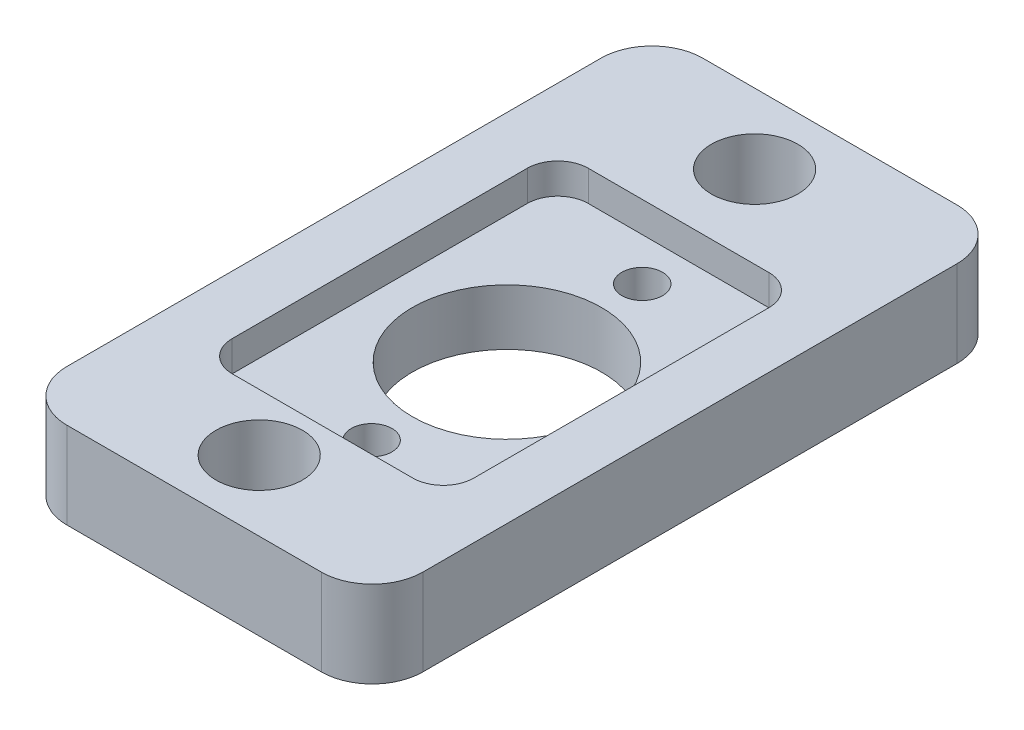
ISO-10303-21;
HEADER;
FILE_DESCRIPTION(('STEP AP214'),'2;1');
FILE_NAME('part.step','',(''),(''),'','','');
FILE_SCHEMA(('AUTOMOTIVE_DESIGN { 1 0 10303 214 1 1 1 1 }'));
ENDSEC;
DATA;
#1=APPLICATION_CONTEXT('core data for automotive mechanical design processes');
#2=APPLICATION_PROTOCOL_DEFINITION('international standard','automotive_design',2000,#1);
#3=PRODUCT_CONTEXT('',#1,'mechanical');
#4=PRODUCT('Part','Part','',(#3));
#5=PRODUCT_RELATED_PRODUCT_CATEGORY('part','',(#4));
#6=PRODUCT_DEFINITION_FORMATION('','',#4);
#7=PRODUCT_DEFINITION_CONTEXT('part definition',#1,'design');
#8=PRODUCT_DEFINITION('design','',#6,#7);
#9=PRODUCT_DEFINITION_SHAPE('','',#8);
#10=(LENGTH_UNIT() NAMED_UNIT(*) SI_UNIT(.MILLI.,.METRE.));
#11=(NAMED_UNIT(*) PLANE_ANGLE_UNIT() SI_UNIT($,.RADIAN.));
#12=(NAMED_UNIT(*) SI_UNIT($,.STERADIAN.) SOLID_ANGLE_UNIT());
#13=UNCERTAINTY_MEASURE_WITH_UNIT(LENGTH_MEASURE(1.E-05),#10,'distance_accuracy_value','');
#14=(GEOMETRIC_REPRESENTATION_CONTEXT(3) GLOBAL_UNCERTAINTY_ASSIGNED_CONTEXT((#13)) GLOBAL_UNIT_ASSIGNED_CONTEXT((#10,
#11,#12)) REPRESENTATION_CONTEXT('',''));
#15=CARTESIAN_POINT('',(0.,0.,0.));
#16=DIRECTION('',(0.,0.,1.));
#17=DIRECTION('',(1.,0.,0.));
#18=AXIS2_PLACEMENT_3D('',#15,#16,#17);
#19=CARTESIAN_POINT('',(2.,3.4,23.));
#20=DIRECTION('',(0.,-1.,0.));
#21=DIRECTION('',(0.,0.,-1.));
#22=AXIS2_PLACEMENT_3D('',#19,#20,#21);
#23=CYLINDRICAL_SURFACE('',#22,2.);
#24=CARTESIAN_POINT('',(2.,0.,23.));
#25=DIRECTION('',(0.,1.,0.));
#26=DIRECTION('',(0.,0.,1.));
#27=AXIS2_PLACEMENT_3D('',#24,#25,#26);
#28=CIRCLE('',#27,2.);
#29=CARTESIAN_POINT('',(0.,0.,23.));
#30=VERTEX_POINT('',#29);
#31=CARTESIAN_POINT('',(2.,0.,25.));
#32=VERTEX_POINT('',#31);
#33=EDGE_CURVE('E141',#30,#32,#28,.T.);
#34=ORIENTED_EDGE('',*,*,#33,.T.);
#35=DIRECTION('',(0.,-1.,0.));
#36=VECTOR('',#35,1.);
#37=CARTESIAN_POINT('',(2.,3.4,25.));
#38=LINE('',#37,#36);
#39=CARTESIAN_POINT('',(2.,3.4,25.));
#40=VERTEX_POINT('',#39);
#41=EDGE_CURVE('E11',#40,#32,#38,.T.);
#42=ORIENTED_EDGE('',*,*,#41,.F.);
#43=CARTESIAN_POINT('',(2.,3.4,23.));
#44=DIRECTION('',(0.,1.,0.));
#45=DIRECTION('',(0.,0.,1.));
#46=AXIS2_PLACEMENT_3D('',#43,#44,#45);
#47=CIRCLE('',#46,2.);
#48=CARTESIAN_POINT('',(0.,3.4,23.));
#49=VERTEX_POINT('',#48);
#50=EDGE_CURVE('E157',#49,#40,#47,.T.);
#51=ORIENTED_EDGE('',*,*,#50,.F.);
#52=DIRECTION('',(0.,-1.,0.));
#53=VECTOR('',#52,1.);
#54=CARTESIAN_POINT('',(0.,3.4,23.));
#55=LINE('',#54,#53);
#56=EDGE_CURVE('E137',#49,#30,#55,.T.);
#57=ORIENTED_EDGE('',*,*,#56,.T.);
#58=EDGE_LOOP('',(#34,#42,#51,#57));
#59=FACE_BOUND('',#58,.T.);
#60=ADVANCED_FACE('F33',(#59),#23,.T.);
#61=CARTESIAN_POINT('',(2.,3.4,25.));
#62=DIRECTION('',(0.,0.,-1.));
#63=DIRECTION('',(-1.,0.,0.));
#64=AXIS2_PLACEMENT_3D('',#61,#62,#63);
#65=PLANE('',#64);
#66=DIRECTION('',(1.,0.,0.));
#67=VECTOR('',#66,1.);
#68=CARTESIAN_POINT('',(2.,0.,25.));
#69=LINE('',#68,#67);
#70=CARTESIAN_POINT('',(12.,0.,25.));
#71=VERTEX_POINT('',#70);
#72=EDGE_CURVE('E144',#32,#71,#69,.T.);
#73=ORIENTED_EDGE('',*,*,#72,.T.);
#74=DIRECTION('',(0.,-1.,0.));
#75=VECTOR('',#74,1.);
#76=CARTESIAN_POINT('',(12.,3.4,25.));
#77=LINE('',#76,#75);
#78=CARTESIAN_POINT('',(12.,3.4,25.));
#79=VERTEX_POINT('',#78);
#80=EDGE_CURVE('E40',#79,#71,#77,.T.);
#81=ORIENTED_EDGE('',*,*,#80,.F.);
#82=DIRECTION('',(1.,0.,0.));
#83=VECTOR('',#82,1.);
#84=CARTESIAN_POINT('',(2.,3.4,25.));
#85=LINE('',#84,#83);
#86=EDGE_CURVE('E97',#40,#79,#85,.T.);
#87=ORIENTED_EDGE('',*,*,#86,.F.);
#88=ORIENTED_EDGE('',*,*,#41,.T.);
#89=EDGE_LOOP('',(#73,#81,#87,#88));
#90=FACE_BOUND('',#89,.T.);
#91=ADVANCED_FACE('F365',(#90),#65,.F.);
#92=CARTESIAN_POINT('',(12.,3.4,23.));
#93=DIRECTION('',(0.,-1.,0.));
#94=DIRECTION('',(0.,0.,-1.));
#95=AXIS2_PLACEMENT_3D('',#92,#93,#94);
#96=CYLINDRICAL_SURFACE('',#95,2.);
#97=CARTESIAN_POINT('',(12.,0.,23.));
#98=DIRECTION('',(0.,1.,0.));
#99=DIRECTION('',(0.,0.,1.));
#100=AXIS2_PLACEMENT_3D('',#97,#98,#99);
#101=CIRCLE('',#100,2.);
#102=CARTESIAN_POINT('',(14.,0.,23.));
#103=VERTEX_POINT('',#102);
#104=EDGE_CURVE('E147',#71,#103,#101,.T.);
#105=ORIENTED_EDGE('',*,*,#104,.T.);
#106=DIRECTION('',(0.,-1.,0.));
#107=VECTOR('',#106,1.);
#108=CARTESIAN_POINT('',(14.,3.4,23.));
#109=LINE('',#108,#107);
#110=CARTESIAN_POINT('',(14.,3.4,23.));
#111=VERTEX_POINT('',#110);
#112=EDGE_CURVE('E164',#111,#103,#109,.T.);
#113=ORIENTED_EDGE('',*,*,#112,.F.);
#114=CARTESIAN_POINT('',(12.,3.4,23.));
#115=DIRECTION('',(0.,1.,0.));
#116=DIRECTION('',(0.,0.,1.));
#117=AXIS2_PLACEMENT_3D('',#114,#115,#116);
#118=CIRCLE('',#117,2.);
#119=EDGE_CURVE('E172',#79,#111,#118,.T.);
#120=ORIENTED_EDGE('',*,*,#119,.F.);
#121=ORIENTED_EDGE('',*,*,#80,.T.);
#122=EDGE_LOOP('',(#105,#113,#120,#121));
#123=FACE_BOUND('',#122,.T.);
#124=ADVANCED_FACE('F170',(#123),#96,.T.);
#125=CARTESIAN_POINT('',(14.,3.4,2.));
#126=DIRECTION('',(-1.,0.,0.));
#127=DIRECTION('',(0.,0.,1.));
#128=AXIS2_PLACEMENT_3D('',#125,#126,#127);
#129=PLANE('',#128);
#130=DIRECTION('',(0.,0.,-1.));
#131=VECTOR('',#130,1.);
#132=CARTESIAN_POINT('',(14.,0.,2.));
#133=LINE('',#132,#131);
#134=CARTESIAN_POINT('',(14.,0.,2.));
#135=VERTEX_POINT('',#134);
#136=EDGE_CURVE('E149',#103,#135,#133,.T.);
#137=ORIENTED_EDGE('',*,*,#136,.T.);
#138=DIRECTION('',(0.,-1.,0.));
#139=VECTOR('',#138,1.);
#140=CARTESIAN_POINT('',(14.,3.4,2.));
#141=LINE('',#140,#139);
#142=CARTESIAN_POINT('',(14.,3.4,2.));
#143=VERTEX_POINT('',#142);
#144=EDGE_CURVE('E161',#143,#135,#141,.T.);
#145=ORIENTED_EDGE('',*,*,#144,.F.);
#146=DIRECTION('',(0.,0.,-1.));
#147=VECTOR('',#146,1.);
#148=CARTESIAN_POINT('',(14.,3.4,2.));
#149=LINE('',#148,#147);
#150=EDGE_CURVE('E184',#111,#143,#149,.T.);
#151=ORIENTED_EDGE('',*,*,#150,.F.);
#152=ORIENTED_EDGE('',*,*,#112,.T.);
#153=EDGE_LOOP('',(#137,#145,#151,#152));
#154=FACE_BOUND('',#153,.T.);
#155=ADVANCED_FACE('F180',(#154),#129,.F.);
#156=CARTESIAN_POINT('',(12.,3.4,2.));
#157=DIRECTION('',(0.,-1.,0.));
#158=DIRECTION('',(0.,0.,-1.));
#159=AXIS2_PLACEMENT_3D('',#156,#157,#158);
#160=CYLINDRICAL_SURFACE('',#159,2.);
#161=CARTESIAN_POINT('',(12.,0.,2.));
#162=DIRECTION('',(0.,1.,0.));
#163=DIRECTION('',(0.,0.,-1.));
#164=AXIS2_PLACEMENT_3D('',#161,#162,#163);
#165=CIRCLE('',#164,2.);
#166=CARTESIAN_POINT('',(12.,0.,0.));
#167=VERTEX_POINT('',#166);
#168=EDGE_CURVE('E151',#135,#167,#165,.T.);
#169=ORIENTED_EDGE('',*,*,#168,.T.);
#170=DIRECTION('',(0.,-1.,0.));
#171=VECTOR('',#170,1.);
#172=CARTESIAN_POINT('',(12.,3.4,0.));
#173=LINE('',#172,#171);
#174=CARTESIAN_POINT('',(12.,3.4,0.));
#175=VERTEX_POINT('',#174);
#176=EDGE_CURVE('E132',#175,#167,#173,.T.);
#177=ORIENTED_EDGE('',*,*,#176,.F.);
#178=CARTESIAN_POINT('',(12.,3.4,2.));
#179=DIRECTION('',(0.,1.,0.));
#180=DIRECTION('',(0.,0.,-1.));
#181=AXIS2_PLACEMENT_3D('',#178,#179,#180);
#182=CIRCLE('',#181,2.);
#183=EDGE_CURVE('E120',#143,#175,#182,.T.);
#184=ORIENTED_EDGE('',*,*,#183,.F.);
#185=ORIENTED_EDGE('',*,*,#144,.T.);
#186=EDGE_LOOP('',(#169,#177,#184,#185));
#187=FACE_BOUND('',#186,.T.);
#188=ADVANCED_FACE('F183',(#187),#160,.T.);
#189=CARTESIAN_POINT('',(2.00000000000001,3.4,0.));
#190=DIRECTION('',(0.,0.,1.));
#191=DIRECTION('',(1.,0.,0.));
#192=AXIS2_PLACEMENT_3D('',#189,#190,#191);
#193=PLANE('',#192);
#194=DIRECTION('',(-1.,0.,0.));
#195=VECTOR('',#194,1.);
#196=CARTESIAN_POINT('',(2.00000000000001,0.,0.));
#197=LINE('',#196,#195);
#198=CARTESIAN_POINT('',(2.00000000000001,0.,0.));
#199=VERTEX_POINT('',#198);
#200=EDGE_CURVE('E129',#167,#199,#197,.T.);
#201=ORIENTED_EDGE('',*,*,#200,.T.);
#202=DIRECTION('',(0.,-1.,0.));
#203=VECTOR('',#202,1.);
#204=CARTESIAN_POINT('',(2.00000000000001,3.4,0.));
#205=LINE('',#204,#203);
#206=CARTESIAN_POINT('',(2.00000000000001,3.4,0.));
#207=VERTEX_POINT('',#206);
#208=EDGE_CURVE('E126',#207,#199,#205,.T.);
#209=ORIENTED_EDGE('',*,*,#208,.F.);
#210=DIRECTION('',(-1.,0.,0.));
#211=VECTOR('',#210,1.);
#212=CARTESIAN_POINT('',(2.00000000000001,3.4,0.));
#213=LINE('',#212,#211);
#214=EDGE_CURVE('E113',#175,#207,#213,.T.);
#215=ORIENTED_EDGE('',*,*,#214,.F.);
#216=ORIENTED_EDGE('',*,*,#176,.T.);
#217=EDGE_LOOP('',(#201,#209,#215,#216));
#218=FACE_BOUND('',#217,.T.);
#219=ADVANCED_FACE('F127',(#218),#193,.F.);
#220=CARTESIAN_POINT('',(2.,3.4,2.));
#221=DIRECTION('',(0.,-1.,0.));
#222=DIRECTION('',(0.,0.,-1.));
#223=AXIS2_PLACEMENT_3D('',#220,#221,#222);
#224=CYLINDRICAL_SURFACE('',#223,2.);
#225=CARTESIAN_POINT('',(2.,0.,2.));
#226=DIRECTION('',(0.,1.,0.));
#227=DIRECTION('',(0.,0.,1.));
#228=AXIS2_PLACEMENT_3D('',#225,#226,#227);
#229=CIRCLE('',#228,2.);
#230=CARTESIAN_POINT('',(0.,0.,2.00000000000001));
#231=VERTEX_POINT('',#230);
#232=EDGE_CURVE('E154',#199,#231,#229,.T.);
#233=ORIENTED_EDGE('',*,*,#232,.T.);
#234=DIRECTION('',(0.,-1.,0.));
#235=VECTOR('',#234,1.);
#236=CARTESIAN_POINT('',(0.,3.4,2.00000000000001));
#237=LINE('',#236,#235);
#238=CARTESIAN_POINT('',(0.,3.4,2.00000000000001));
#239=VERTEX_POINT('',#238);
#240=EDGE_CURVE('E133',#239,#231,#237,.T.);
#241=ORIENTED_EDGE('',*,*,#240,.F.);
#242=CARTESIAN_POINT('',(2.,3.4,2.));
#243=DIRECTION('',(0.,1.,0.));
#244=DIRECTION('',(0.,0.,1.));
#245=AXIS2_PLACEMENT_3D('',#242,#243,#244);
#246=CIRCLE('',#245,2.);
#247=EDGE_CURVE('E117',#207,#239,#246,.T.);
#248=ORIENTED_EDGE('',*,*,#247,.F.);
#249=ORIENTED_EDGE('',*,*,#208,.T.);
#250=EDGE_LOOP('',(#233,#241,#248,#249));
#251=FACE_BOUND('',#250,.T.);
#252=ADVANCED_FACE('F135',(#251),#224,.T.);
#253=CARTESIAN_POINT('',(0.,3.4,2.00000000000001));
#254=DIRECTION('',(1.,0.,0.));
#255=DIRECTION('',(0.,0.,-1.));
#256=AXIS2_PLACEMENT_3D('',#253,#254,#255);
#257=PLANE('',#256);
#258=DIRECTION('',(0.,0.,1.));
#259=VECTOR('',#258,1.);
#260=CARTESIAN_POINT('',(0.,0.,2.00000000000001));
#261=LINE('',#260,#259);
#262=EDGE_CURVE('E89',#231,#30,#261,.T.);
#263=ORIENTED_EDGE('',*,*,#262,.T.);
#264=ORIENTED_EDGE('',*,*,#56,.F.);
#265=DIRECTION('',(0.,0.,1.));
#266=VECTOR('',#265,1.);
#267=CARTESIAN_POINT('',(0.,3.4,2.00000000000001));
#268=LINE('',#267,#266);
#269=EDGE_CURVE('E56',#239,#49,#268,.T.);
#270=ORIENTED_EDGE('',*,*,#269,.F.);
#271=ORIENTED_EDGE('',*,*,#240,.T.);
#272=EDGE_LOOP('',(#263,#264,#270,#271));
#273=FACE_BOUND('',#272,.T.);
#274=ADVANCED_FACE('F299',(#273),#257,.F.);
#275=CARTESIAN_POINT('',(2.,3.4,23.));
#276=DIRECTION('',(0.,1.,0.));
#277=DIRECTION('',(0.,0.,1.));
#278=AXIS2_PLACEMENT_3D('',#275,#276,#277);
#279=PLANE('',#278);
#280=CARTESIAN_POINT('',(6.8,3.4,2.76));
#281=DIRECTION('',(0.,1.,0.));
#282=DIRECTION('',(0.,0.,1.));
#283=AXIS2_PLACEMENT_3D('',#280,#281,#282);
#284=CIRCLE('',#283,1.7);
#285=CARTESIAN_POINT('',(6.8,3.4,4.46));
#286=VERTEX_POINT('',#285);
#287=EDGE_CURVE('E282',#286,#286,#284,.T.);
#288=ORIENTED_EDGE('',*,*,#287,.F.);
#289=EDGE_LOOP('',(#288));
#290=FACE_BOUND('',#289,.T.);
#291=CARTESIAN_POINT('',(6.8,3.4,22.24));
#292=DIRECTION('',(0.,1.,0.));
#293=DIRECTION('',(0.,0.,-1.));
#294=AXIS2_PLACEMENT_3D('',#291,#292,#293);
#295=CIRCLE('',#294,1.7);
#296=CARTESIAN_POINT('',(6.8,3.4,20.54));
#297=VERTEX_POINT('',#296);
#298=EDGE_CURVE('E276',#297,#297,#295,.T.);
#299=ORIENTED_EDGE('',*,*,#298,.F.);
#300=EDGE_LOOP('',(#299));
#301=FACE_BOUND('',#300,.T.);
#302=CARTESIAN_POINT('',(3.5,3.4,18.8));
#303=DIRECTION('',(0.,1.,0.));
#304=DIRECTION('',(0.,0.,1.));
#305=AXIS2_PLACEMENT_3D('',#302,#303,#304);
#306=CIRCLE('',#305,1.2);
#307=CARTESIAN_POINT('',(2.30000000000001,3.4,18.8));
#308=VERTEX_POINT('',#307);
#309=CARTESIAN_POINT('',(3.5,3.4,20.));
#310=VERTEX_POINT('',#309);
#311=EDGE_CURVE('E47',#308,#310,#306,.T.);
#312=ORIENTED_EDGE('',*,*,#311,.F.);
#313=DIRECTION('',(0.,0.,1.));
#314=VECTOR('',#313,1.);
#315=CARTESIAN_POINT('',(2.30000000000001,3.4,7.2));
#316=LINE('',#315,#314);
#317=CARTESIAN_POINT('',(2.30000000000001,3.4,7.2));
#318=VERTEX_POINT('',#317);
#319=EDGE_CURVE('E212',#318,#308,#316,.T.);
#320=ORIENTED_EDGE('',*,*,#319,.F.);
#321=CARTESIAN_POINT('',(3.5,3.4,7.2));
#322=DIRECTION('',(0.,1.,0.));
#323=DIRECTION('',(0.,0.,1.));
#324=AXIS2_PLACEMENT_3D('',#321,#322,#323);
#325=CIRCLE('',#324,1.2);
#326=CARTESIAN_POINT('',(3.50000000000001,3.4,6.));
#327=VERTEX_POINT('',#326);
#328=EDGE_CURVE('E216',#327,#318,#325,.T.);
#329=ORIENTED_EDGE('',*,*,#328,.F.);
#330=DIRECTION('',(-1.,0.,0.));
#331=VECTOR('',#330,1.);
#332=CARTESIAN_POINT('',(3.50000000000001,3.4,6.));
#333=LINE('',#332,#331);
#334=CARTESIAN_POINT('',(10.6,3.4,6.));
#335=VERTEX_POINT('',#334);
#336=EDGE_CURVE('E219',#335,#327,#333,.T.);
#337=ORIENTED_EDGE('',*,*,#336,.F.);
#338=CARTESIAN_POINT('',(10.6,3.4,7.2));
#339=DIRECTION('',(0.,1.,0.));
#340=DIRECTION('',(0.,0.,-1.));
#341=AXIS2_PLACEMENT_3D('',#338,#339,#340);
#342=CIRCLE('',#341,1.2);
#343=CARTESIAN_POINT('',(11.8,3.4,7.2));
#344=VERTEX_POINT('',#343);
#345=EDGE_CURVE('E222',#344,#335,#342,.T.);
#346=ORIENTED_EDGE('',*,*,#345,.F.);
#347=DIRECTION('',(0.,0.,-1.));
#348=VECTOR('',#347,1.);
#349=CARTESIAN_POINT('',(11.8,3.4,7.2));
#350=LINE('',#349,#348);
#351=CARTESIAN_POINT('',(11.8,3.4,18.8));
#352=VERTEX_POINT('',#351);
#353=EDGE_CURVE('E225',#352,#344,#350,.T.);
#354=ORIENTED_EDGE('',*,*,#353,.F.);
#355=CARTESIAN_POINT('',(10.6,3.4,18.8));
#356=DIRECTION('',(0.,1.,0.));
#357=DIRECTION('',(0.,0.,1.));
#358=AXIS2_PLACEMENT_3D('',#355,#356,#357);
#359=CIRCLE('',#358,1.2);
#360=CARTESIAN_POINT('',(10.6,3.4,20.));
#361=VERTEX_POINT('',#360);
#362=EDGE_CURVE('E228',#361,#352,#359,.T.);
#363=ORIENTED_EDGE('',*,*,#362,.F.);
#364=DIRECTION('',(1.,0.,0.));
#365=VECTOR('',#364,1.);
#366=CARTESIAN_POINT('',(3.5,3.4,20.));
#367=LINE('',#366,#365);
#368=EDGE_CURVE('E231',#310,#361,#367,.T.);
#369=ORIENTED_EDGE('',*,*,#368,.F.);
#370=EDGE_LOOP('',(#312,#320,#329,#337,#346,#354,#363,#369));
#371=FACE_BOUND('',#370,.T.);
#372=ORIENTED_EDGE('',*,*,#50,.T.);
#373=ORIENTED_EDGE('',*,*,#86,.T.);
#374=ORIENTED_EDGE('',*,*,#119,.T.);
#375=ORIENTED_EDGE('',*,*,#150,.T.);
#376=ORIENTED_EDGE('',*,*,#183,.T.);
#377=ORIENTED_EDGE('',*,*,#214,.T.);
#378=ORIENTED_EDGE('',*,*,#247,.T.);
#379=ORIENTED_EDGE('',*,*,#269,.T.);
#380=EDGE_LOOP('',(#372,#373,#374,#375,#376,#377,#378,#379));
#381=FACE_BOUND('',#380,.T.);
#382=ADVANCED_FACE('F115',(#290,#301,#371,#381),#279,.T.);
#383=CARTESIAN_POINT('',(2.,0.,23.));
#384=DIRECTION('',(0.,1.,0.));
#385=DIRECTION('',(0.,0.,1.));
#386=AXIS2_PLACEMENT_3D('',#383,#384,#385);
#387=PLANE('',#386);
#388=CARTESIAN_POINT('',(6.8,0.,2.76));
#389=DIRECTION('',(0.,1.,0.));
#390=DIRECTION('',(0.,0.,1.));
#391=AXIS2_PLACEMENT_3D('',#388,#389,#390);
#392=CIRCLE('',#391,1.7);
#393=CARTESIAN_POINT('',(6.8,0.,4.46));
#394=VERTEX_POINT('',#393);
#395=EDGE_CURVE('E262',#394,#394,#392,.T.);
#396=ORIENTED_EDGE('',*,*,#395,.T.);
#397=EDGE_LOOP('',(#396));
#398=FACE_BOUND('',#397,.T.);
#399=CARTESIAN_POINT('',(6.8,0.,22.24));
#400=DIRECTION('',(0.,1.,0.));
#401=DIRECTION('',(0.,0.,-1.));
#402=AXIS2_PLACEMENT_3D('',#399,#400,#401);
#403=CIRCLE('',#402,1.7);
#404=CARTESIAN_POINT('',(6.8,0.,20.54));
#405=VERTEX_POINT('',#404);
#406=EDGE_CURVE('E279',#405,#405,#403,.T.);
#407=ORIENTED_EDGE('',*,*,#406,.T.);
#408=EDGE_LOOP('',(#407));
#409=FACE_BOUND('',#408,.T.);
#410=CARTESIAN_POINT('',(7.30000000000001,0.,7.68));
#411=DIRECTION('',(0.,1.,0.));
#412=DIRECTION('',(0.,0.,1.));
#413=AXIS2_PLACEMENT_3D('',#410,#411,#412);
#414=CIRCLE('',#413,0.800000000000002);
#415=CARTESIAN_POINT('',(7.30000000000001,0.,8.48));
#416=VERTEX_POINT('',#415);
#417=EDGE_CURVE('E235',#416,#416,#414,.T.);
#418=ORIENTED_EDGE('',*,*,#417,.T.);
#419=EDGE_LOOP('',(#418));
#420=FACE_BOUND('',#419,.T.);
#421=CARTESIAN_POINT('',(7.30000000000001,0.,18.32));
#422=DIRECTION('',(0.,1.,0.));
#423=DIRECTION('',(0.,0.,1.));
#424=AXIS2_PLACEMENT_3D('',#421,#422,#423);
#425=CIRCLE('',#424,0.800000000000006);
#426=CARTESIAN_POINT('',(7.30000000000001,0.,19.12));
#427=VERTEX_POINT('',#426);
#428=EDGE_CURVE('E268',#427,#427,#425,.T.);
#429=ORIENTED_EDGE('',*,*,#428,.T.);
#430=EDGE_LOOP('',(#429));
#431=FACE_BOUND('',#430,.T.);
#432=CARTESIAN_POINT('',(7.30000000000001,0.,13.));
#433=DIRECTION('',(0.,1.,0.));
#434=DIRECTION('',(0.,0.,1.));
#435=AXIS2_PLACEMENT_3D('',#432,#433,#434);
#436=CIRCLE('',#435,3.72);
#437=CARTESIAN_POINT('',(7.30000000000001,0.,16.72));
#438=VERTEX_POINT('',#437);
#439=EDGE_CURVE('E261',#438,#438,#436,.T.);
#440=ORIENTED_EDGE('',*,*,#439,.T.);
#441=EDGE_LOOP('',(#440));
#442=FACE_BOUND('',#441,.T.);
#443=ORIENTED_EDGE('',*,*,#33,.F.);
#444=ORIENTED_EDGE('',*,*,#262,.F.);
#445=ORIENTED_EDGE('',*,*,#232,.F.);
#446=ORIENTED_EDGE('',*,*,#200,.F.);
#447=ORIENTED_EDGE('',*,*,#168,.F.);
#448=ORIENTED_EDGE('',*,*,#136,.F.);
#449=ORIENTED_EDGE('',*,*,#104,.F.);
#450=ORIENTED_EDGE('',*,*,#72,.F.);
#451=EDGE_LOOP('',(#443,#444,#445,#446,#447,#448,#449,#450));
#452=FACE_BOUND('',#451,.T.);
#453=ADVANCED_FACE('F176',(#398,#409,#420,#431,#442,#452),#387,.F.);
#454=CARTESIAN_POINT('',(3.5,2.2,18.8));
#455=DIRECTION('',(0.,1.,0.));
#456=DIRECTION('',(0.,0.,1.));
#457=AXIS2_PLACEMENT_3D('',#454,#455,#456);
#458=CYLINDRICAL_SURFACE('',#457,1.2);
#459=ORIENTED_EDGE('',*,*,#311,.T.);
#460=DIRECTION('',(0.,1.,0.));
#461=VECTOR('',#460,1.);
#462=CARTESIAN_POINT('',(3.5,2.2,20.));
#463=LINE('',#462,#461);
#464=CARTESIAN_POINT('',(3.5,2.2,20.));
#465=VERTEX_POINT('',#464);
#466=EDGE_CURVE('E190',#465,#310,#463,.T.);
#467=ORIENTED_EDGE('',*,*,#466,.F.);
#468=CARTESIAN_POINT('',(3.5,2.2,18.8));
#469=DIRECTION('',(0.,1.,0.));
#470=DIRECTION('',(0.,0.,1.));
#471=AXIS2_PLACEMENT_3D('',#468,#469,#470);
#472=CIRCLE('',#471,1.2);
#473=CARTESIAN_POINT('',(2.30000000000001,2.2,18.8));
#474=VERTEX_POINT('',#473);
#475=EDGE_CURVE('E215',#474,#465,#472,.T.);
#476=ORIENTED_EDGE('',*,*,#475,.F.);
#477=DIRECTION('',(0.,1.,0.));
#478=VECTOR('',#477,1.);
#479=CARTESIAN_POINT('',(2.30000000000001,2.2,18.8));
#480=LINE('',#479,#478);
#481=EDGE_CURVE('E145',#474,#308,#480,.T.);
#482=ORIENTED_EDGE('',*,*,#481,.T.);
#483=EDGE_LOOP('',(#459,#467,#476,#482));
#484=FACE_BOUND('',#483,.T.);
#485=ADVANCED_FACE('F352',(#484),#458,.F.);
#486=CARTESIAN_POINT('',(2.30000000000001,2.2,7.2));
#487=DIRECTION('',(-1.,0.,0.));
#488=DIRECTION('',(0.,0.,1.));
#489=AXIS2_PLACEMENT_3D('',#486,#487,#488);
#490=PLANE('',#489);
#491=ORIENTED_EDGE('',*,*,#319,.T.);
#492=ORIENTED_EDGE('',*,*,#481,.F.);
#493=DIRECTION('',(0.,0.,1.));
#494=VECTOR('',#493,1.);
#495=CARTESIAN_POINT('',(2.30000000000001,2.2,7.2));
#496=LINE('',#495,#494);
#497=CARTESIAN_POINT('',(2.30000000000001,2.2,7.2));
#498=VERTEX_POINT('',#497);
#499=EDGE_CURVE('E193',#498,#474,#496,.T.);
#500=ORIENTED_EDGE('',*,*,#499,.F.);
#501=DIRECTION('',(0.,1.,0.));
#502=VECTOR('',#501,1.);
#503=CARTESIAN_POINT('',(2.30000000000001,2.2,7.2));
#504=LINE('',#503,#502);
#505=EDGE_CURVE('E208',#498,#318,#504,.T.);
#506=ORIENTED_EDGE('',*,*,#505,.T.);
#507=EDGE_LOOP('',(#491,#492,#500,#506));
#508=FACE_BOUND('',#507,.T.);
#509=ADVANCED_FACE('F354',(#508),#490,.F.);
#510=CARTESIAN_POINT('',(3.5,2.2,7.2));
#511=DIRECTION('',(0.,1.,0.));
#512=DIRECTION('',(0.,0.,1.));
#513=AXIS2_PLACEMENT_3D('',#510,#511,#512);
#514=CYLINDRICAL_SURFACE('',#513,1.2);
#515=ORIENTED_EDGE('',*,*,#328,.T.);
#516=ORIENTED_EDGE('',*,*,#505,.F.);
#517=CARTESIAN_POINT('',(3.5,2.2,7.2));
#518=DIRECTION('',(0.,1.,0.));
#519=DIRECTION('',(0.,0.,1.));
#520=AXIS2_PLACEMENT_3D('',#517,#518,#519);
#521=CIRCLE('',#520,1.2);
#522=CARTESIAN_POINT('',(3.50000000000001,2.2,6.));
#523=VERTEX_POINT('',#522);
#524=EDGE_CURVE('E238',#523,#498,#521,.T.);
#525=ORIENTED_EDGE('',*,*,#524,.F.);
#526=DIRECTION('',(0.,1.,0.));
#527=VECTOR('',#526,1.);
#528=CARTESIAN_POINT('',(3.50000000000001,2.2,6.));
#529=LINE('',#528,#527);
#530=EDGE_CURVE('E205',#523,#327,#529,.T.);
#531=ORIENTED_EDGE('',*,*,#530,.T.);
#532=EDGE_LOOP('',(#515,#516,#525,#531));
#533=FACE_BOUND('',#532,.T.);
#534=ADVANCED_FACE('F360',(#533),#514,.F.);
#535=CARTESIAN_POINT('',(3.50000000000001,2.2,6.));
#536=DIRECTION('',(0.,0.,-1.));
#537=DIRECTION('',(-1.,0.,0.));
#538=AXIS2_PLACEMENT_3D('',#535,#536,#537);
#539=PLANE('',#538);
#540=ORIENTED_EDGE('',*,*,#336,.T.);
#541=ORIENTED_EDGE('',*,*,#530,.F.);
#542=DIRECTION('',(-1.,0.,0.));
#543=VECTOR('',#542,1.);
#544=CARTESIAN_POINT('',(3.50000000000001,2.2,6.));
#545=LINE('',#544,#543);
#546=CARTESIAN_POINT('',(10.6,2.2,6.));
#547=VERTEX_POINT('',#546);
#548=EDGE_CURVE('E241',#547,#523,#545,.T.);
#549=ORIENTED_EDGE('',*,*,#548,.F.);
#550=DIRECTION('',(0.,1.,0.));
#551=VECTOR('',#550,1.);
#552=CARTESIAN_POINT('',(10.6,2.2,6.));
#553=LINE('',#552,#551);
#554=EDGE_CURVE('E202',#547,#335,#553,.T.);
#555=ORIENTED_EDGE('',*,*,#554,.T.);
#556=EDGE_LOOP('',(#540,#541,#549,#555));
#557=FACE_BOUND('',#556,.T.);
#558=ADVANCED_FACE('F431',(#557),#539,.F.);
#559=CARTESIAN_POINT('',(10.6,2.2,7.2));
#560=DIRECTION('',(0.,1.,0.));
#561=DIRECTION('',(0.,0.,1.));
#562=AXIS2_PLACEMENT_3D('',#559,#560,#561);
#563=CYLINDRICAL_SURFACE('',#562,1.2);
#564=ORIENTED_EDGE('',*,*,#345,.T.);
#565=ORIENTED_EDGE('',*,*,#554,.F.);
#566=CARTESIAN_POINT('',(10.6,2.2,7.2));
#567=DIRECTION('',(0.,1.,0.));
#568=DIRECTION('',(0.,0.,-1.));
#569=AXIS2_PLACEMENT_3D('',#566,#567,#568);
#570=CIRCLE('',#569,1.2);
#571=CARTESIAN_POINT('',(11.8,2.2,7.2));
#572=VERTEX_POINT('',#571);
#573=EDGE_CURVE('E244',#572,#547,#570,.T.);
#574=ORIENTED_EDGE('',*,*,#573,.F.);
#575=DIRECTION('',(0.,1.,0.));
#576=VECTOR('',#575,1.);
#577=CARTESIAN_POINT('',(11.8,2.2,7.2));
#578=LINE('',#577,#576);
#579=EDGE_CURVE('E199',#572,#344,#578,.T.);
#580=ORIENTED_EDGE('',*,*,#579,.T.);
#581=EDGE_LOOP('',(#564,#565,#574,#580));
#582=FACE_BOUND('',#581,.T.);
#583=ADVANCED_FACE('F441',(#582),#563,.F.);
#584=CARTESIAN_POINT('',(11.8,2.2,7.2));
#585=DIRECTION('',(1.,0.,0.));
#586=DIRECTION('',(0.,0.,-1.));
#587=AXIS2_PLACEMENT_3D('',#584,#585,#586);
#588=PLANE('',#587);
#589=ORIENTED_EDGE('',*,*,#353,.T.);
#590=ORIENTED_EDGE('',*,*,#579,.F.);
#591=DIRECTION('',(0.,0.,-1.));
#592=VECTOR('',#591,1.);
#593=CARTESIAN_POINT('',(11.8,2.2,7.2));
#594=LINE('',#593,#592);
#595=CARTESIAN_POINT('',(11.8,2.2,18.8));
#596=VERTEX_POINT('',#595);
#597=EDGE_CURVE('E247',#596,#572,#594,.T.);
#598=ORIENTED_EDGE('',*,*,#597,.F.);
#599=DIRECTION('',(0.,1.,0.));
#600=VECTOR('',#599,1.);
#601=CARTESIAN_POINT('',(11.8,2.2,18.8));
#602=LINE('',#601,#600);
#603=EDGE_CURVE('E196',#596,#352,#602,.T.);
#604=ORIENTED_EDGE('',*,*,#603,.T.);
#605=EDGE_LOOP('',(#589,#590,#598,#604));
#606=FACE_BOUND('',#605,.T.);
#607=ADVANCED_FACE('F451',(#606),#588,.F.);
#608=CARTESIAN_POINT('',(10.6,2.2,18.8));
#609=DIRECTION('',(0.,1.,0.));
#610=DIRECTION('',(0.,0.,1.));
#611=AXIS2_PLACEMENT_3D('',#608,#609,#610);
#612=CYLINDRICAL_SURFACE('',#611,1.2);
#613=ORIENTED_EDGE('',*,*,#362,.T.);
#614=ORIENTED_EDGE('',*,*,#603,.F.);
#615=CARTESIAN_POINT('',(10.6,2.2,18.8));
#616=DIRECTION('',(0.,1.,0.));
#617=DIRECTION('',(0.,0.,1.));
#618=AXIS2_PLACEMENT_3D('',#615,#616,#617);
#619=CIRCLE('',#618,1.2);
#620=CARTESIAN_POINT('',(10.6,2.2,20.));
#621=VERTEX_POINT('',#620);
#622=EDGE_CURVE('E250',#621,#596,#619,.T.);
#623=ORIENTED_EDGE('',*,*,#622,.F.);
#624=DIRECTION('',(0.,1.,0.));
#625=VECTOR('',#624,1.);
#626=CARTESIAN_POINT('',(10.6,2.2,20.));
#627=LINE('',#626,#625);
#628=EDGE_CURVE('E192',#621,#361,#627,.T.);
#629=ORIENTED_EDGE('',*,*,#628,.T.);
#630=EDGE_LOOP('',(#613,#614,#623,#629));
#631=FACE_BOUND('',#630,.T.);
#632=ADVANCED_FACE('F348',(#631),#612,.F.);
#633=CARTESIAN_POINT('',(3.5,2.2,20.));
#634=DIRECTION('',(0.,0.,1.));
#635=DIRECTION('',(1.,0.,0.));
#636=AXIS2_PLACEMENT_3D('',#633,#634,#635);
#637=PLANE('',#636);
#638=ORIENTED_EDGE('',*,*,#368,.T.);
#639=ORIENTED_EDGE('',*,*,#628,.F.);
#640=DIRECTION('',(1.,0.,0.));
#641=VECTOR('',#640,1.);
#642=CARTESIAN_POINT('',(3.5,2.2,20.));
#643=LINE('',#642,#641);
#644=EDGE_CURVE('E253',#465,#621,#643,.T.);
#645=ORIENTED_EDGE('',*,*,#644,.F.);
#646=ORIENTED_EDGE('',*,*,#466,.T.);
#647=EDGE_LOOP('',(#638,#639,#645,#646));
#648=FACE_BOUND('',#647,.T.);
#649=ADVANCED_FACE('F346',(#648),#637,.F.);
#650=CARTESIAN_POINT('',(3.5,2.2,18.8));
#651=DIRECTION('',(0.,1.,0.));
#652=DIRECTION('',(0.,0.,1.));
#653=AXIS2_PLACEMENT_3D('',#650,#651,#652);
#654=PLANE('',#653);
#655=CARTESIAN_POINT('',(7.30000000000001,2.2,13.));
#656=DIRECTION('',(0.,1.,0.));
#657=DIRECTION('',(0.,0.,1.));
#658=AXIS2_PLACEMENT_3D('',#655,#656,#657);
#659=CIRCLE('',#658,3.72);
#660=CARTESIAN_POINT('',(7.30000000000001,2.2,16.72));
#661=VERTEX_POINT('',#660);
#662=EDGE_CURVE('E258',#661,#661,#659,.T.);
#663=ORIENTED_EDGE('',*,*,#662,.F.);
#664=EDGE_LOOP('',(#663));
#665=FACE_BOUND('',#664,.T.);
#666=CARTESIAN_POINT('',(7.30000000000001,2.2,7.68));
#667=DIRECTION('',(0.,1.,0.));
#668=DIRECTION('',(0.,0.,1.));
#669=AXIS2_PLACEMENT_3D('',#666,#667,#668);
#670=CIRCLE('',#669,0.800000000000002);
#671=CARTESIAN_POINT('',(7.30000000000001,2.2,8.48));
#672=VERTEX_POINT('',#671);
#673=EDGE_CURVE('E271',#672,#672,#670,.T.);
#674=ORIENTED_EDGE('',*,*,#673,.F.);
#675=EDGE_LOOP('',(#674));
#676=FACE_BOUND('',#675,.T.);
#677=CARTESIAN_POINT('',(7.30000000000001,2.2,18.32));
#678=DIRECTION('',(0.,1.,0.));
#679=DIRECTION('',(0.,0.,1.));
#680=AXIS2_PLACEMENT_3D('',#677,#678,#679);
#681=CIRCLE('',#680,0.800000000000006);
#682=CARTESIAN_POINT('',(7.30000000000001,2.2,19.12));
#683=VERTEX_POINT('',#682);
#684=EDGE_CURVE('E265',#683,#683,#681,.T.);
#685=ORIENTED_EDGE('',*,*,#684,.F.);
#686=EDGE_LOOP('',(#685));
#687=FACE_BOUND('',#686,.T.);
#688=ORIENTED_EDGE('',*,*,#475,.T.);
#689=ORIENTED_EDGE('',*,*,#644,.T.);
#690=ORIENTED_EDGE('',*,*,#622,.T.);
#691=ORIENTED_EDGE('',*,*,#597,.T.);
#692=ORIENTED_EDGE('',*,*,#573,.T.);
#693=ORIENTED_EDGE('',*,*,#548,.T.);
#694=ORIENTED_EDGE('',*,*,#524,.T.);
#695=ORIENTED_EDGE('',*,*,#499,.T.);
#696=EDGE_LOOP('',(#688,#689,#690,#691,#692,#693,#694,#695));
#697=FACE_BOUND('',#696,.T.);
#698=ADVANCED_FACE('F351',(#665,#676,#687,#697),#654,.T.);
#699=CARTESIAN_POINT('',(7.30000000000001,0.,18.32));
#700=DIRECTION('',(0.,1.,0.));
#701=DIRECTION('',(0.,0.,1.));
#702=AXIS2_PLACEMENT_3D('',#699,#700,#701);
#703=CYLINDRICAL_SURFACE('',#702,0.800000000000006);
#704=ORIENTED_EDGE('',*,*,#428,.F.);
#705=EDGE_LOOP('',(#704));
#706=FACE_BOUND('',#705,.T.);
#707=ORIENTED_EDGE('',*,*,#684,.T.);
#708=EDGE_LOOP('',(#707));
#709=FACE_BOUND('',#708,.T.);
#710=ADVANCED_FACE('F485',(#706,#709),#703,.F.);
#711=CARTESIAN_POINT('',(7.30000000000001,0.,7.68));
#712=DIRECTION('',(0.,1.,0.));
#713=DIRECTION('',(0.,0.,1.));
#714=AXIS2_PLACEMENT_3D('',#711,#712,#713);
#715=CYLINDRICAL_SURFACE('',#714,0.800000000000002);
#716=ORIENTED_EDGE('',*,*,#417,.F.);
#717=EDGE_LOOP('',(#716));
#718=FACE_BOUND('',#717,.T.);
#719=ORIENTED_EDGE('',*,*,#673,.T.);
#720=EDGE_LOOP('',(#719));
#721=FACE_BOUND('',#720,.T.);
#722=ADVANCED_FACE('F495',(#718,#721),#715,.F.);
#723=CARTESIAN_POINT('',(7.30000000000001,0.,13.));
#724=DIRECTION('',(0.,1.,0.));
#725=DIRECTION('',(0.,0.,1.));
#726=AXIS2_PLACEMENT_3D('',#723,#724,#725);
#727=CYLINDRICAL_SURFACE('',#726,3.72);
#728=ORIENTED_EDGE('',*,*,#439,.F.);
#729=EDGE_LOOP('',(#728));
#730=FACE_BOUND('',#729,.T.);
#731=ORIENTED_EDGE('',*,*,#662,.T.);
#732=EDGE_LOOP('',(#731));
#733=FACE_BOUND('',#732,.T.);
#734=ADVANCED_FACE('F505',(#730,#733),#727,.F.);
#735=CARTESIAN_POINT('',(6.8,0.,22.24));
#736=DIRECTION('',(0.,1.,0.));
#737=DIRECTION('',(0.,0.,1.));
#738=AXIS2_PLACEMENT_3D('',#735,#736,#737);
#739=CYLINDRICAL_SURFACE('',#738,1.7);
#740=ORIENTED_EDGE('',*,*,#406,.F.);
#741=EDGE_LOOP('',(#740));
#742=FACE_BOUND('',#741,.T.);
#743=ORIENTED_EDGE('',*,*,#298,.T.);
#744=EDGE_LOOP('',(#743));
#745=FACE_BOUND('',#744,.T.);
#746=ADVANCED_FACE('F293',(#742,#745),#739,.F.);
#747=CARTESIAN_POINT('',(6.8,0.,2.76));
#748=DIRECTION('',(0.,1.,0.));
#749=DIRECTION('',(0.,0.,1.));
#750=AXIS2_PLACEMENT_3D('',#747,#748,#749);
#751=CYLINDRICAL_SURFACE('',#750,1.7);
#752=ORIENTED_EDGE('',*,*,#395,.F.);
#753=EDGE_LOOP('',(#752));
#754=FACE_BOUND('',#753,.T.);
#755=ORIENTED_EDGE('',*,*,#287,.T.);
#756=EDGE_LOOP('',(#755));
#757=FACE_BOUND('',#756,.T.);
#758=ADVANCED_FACE('F290',(#754,#757),#751,.F.);
#759=CLOSED_SHELL('',(#60,#91,#124,#155,#188,#219,#252,#274,#382,#453,#485,#509,#534,#558,#583,
#607,#632,#649,#698,#710,#722,#734,#746,#758));
#760=MANIFOLD_SOLID_BREP('B2',#759);
#761=ADVANCED_BREP_SHAPE_REPRESENTATION('',(#18,#760),#14);
#762=SHAPE_DEFINITION_REPRESENTATION(#9,#761);
ENDSEC;
END-ISO-10303-21;
